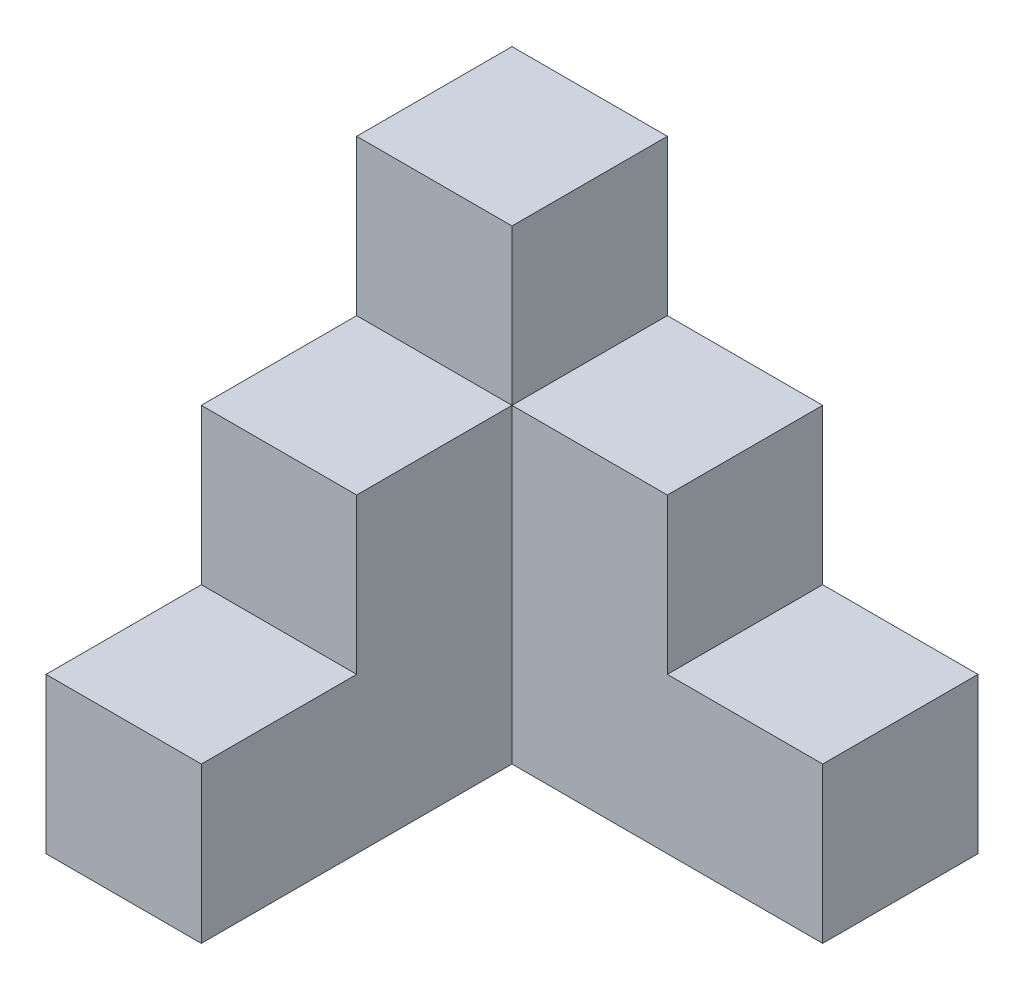
ISO-10303-21;
HEADER;
FILE_DESCRIPTION(('STEP AP214'),'2;1');
FILE_NAME('part.step','',(''),(''),'','','');
FILE_SCHEMA(('AUTOMOTIVE_DESIGN { 1 0 10303 214 1 1 1 1 }'));
ENDSEC;
DATA;
#1=APPLICATION_CONTEXT('core data for automotive mechanical design processes');
#2=APPLICATION_PROTOCOL_DEFINITION('international standard','automotive_design',2000,#1);
#3=PRODUCT_CONTEXT('',#1,'mechanical');
#4=PRODUCT('Part','Part','',(#3));
#5=PRODUCT_RELATED_PRODUCT_CATEGORY('part','',(#4));
#6=PRODUCT_DEFINITION_FORMATION('','',#4);
#7=PRODUCT_DEFINITION_CONTEXT('part definition',#1,'design');
#8=PRODUCT_DEFINITION('design','',#6,#7);
#9=PRODUCT_DEFINITION_SHAPE('','',#8);
#10=(LENGTH_UNIT() NAMED_UNIT(*) SI_UNIT(.MILLI.,.METRE.));
#11=(NAMED_UNIT(*) PLANE_ANGLE_UNIT() SI_UNIT($,.RADIAN.));
#12=(NAMED_UNIT(*) SI_UNIT($,.STERADIAN.) SOLID_ANGLE_UNIT());
#13=UNCERTAINTY_MEASURE_WITH_UNIT(LENGTH_MEASURE(1.E-05),#10,'distance_accuracy_value','');
#14=(GEOMETRIC_REPRESENTATION_CONTEXT(3) GLOBAL_UNCERTAINTY_ASSIGNED_CONTEXT((#13)) GLOBAL_UNIT_ASSIGNED_CONTEXT((#10,
#11,#12)) REPRESENTATION_CONTEXT('',''));
#15=CARTESIAN_POINT('',(0.,0.,0.));
#16=DIRECTION('',(0.,0.,1.));
#17=DIRECTION('',(1.,0.,0.));
#18=AXIS2_PLACEMENT_3D('',#15,#16,#17);
#19=CARTESIAN_POINT('',(0.,20.,0.));
#20=DIRECTION('',(0.,1.,0.));
#21=DIRECTION('',(0.,0.,1.));
#22=AXIS2_PLACEMENT_3D('',#19,#20,#21);
#23=PLANE('',#22);
#24=DIRECTION('',(0.,0.,-1.));
#25=VECTOR('',#24,1.);
#26=CARTESIAN_POINT('',(-222.247867371091,20.,236.439558245922));
#27=LINE('',#26,#25);
#28=CARTESIAN_POINT('',(-222.247867371091,20.,246.439558245922));
#29=VERTEX_POINT('',#28);
#30=CARTESIAN_POINT('',(-222.247867371091,20.,236.439558245922));
#31=VERTEX_POINT('',#30);
#32=EDGE_CURVE('E161',#29,#31,#27,.T.);
#33=ORIENTED_EDGE('',*,*,#32,.F.);
#34=DIRECTION('',(1.,0.,0.));
#35=VECTOR('',#34,1.);
#36=CARTESIAN_POINT('',(-212.247867371091,20.,246.439558245922));
#37=LINE('',#36,#35);
#38=CARTESIAN_POINT('',(-212.247867371091,20.,246.439558245922));
#39=VERTEX_POINT('',#38);
#40=EDGE_CURVE('E186',#29,#39,#37,.T.);
#41=ORIENTED_EDGE('',*,*,#40,.T.);
#42=DIRECTION('',(0.,0.,-1.));
#43=VECTOR('',#42,1.);
#44=CARTESIAN_POINT('',(-212.247867371091,20.,236.439558245922));
#45=LINE('',#44,#43);
#46=CARTESIAN_POINT('',(-212.247867371091,20.,236.439558245922));
#47=VERTEX_POINT('',#46);
#48=EDGE_CURVE('E189',#39,#47,#45,.T.);
#49=ORIENTED_EDGE('',*,*,#48,.T.);
#50=DIRECTION('',(-1.,0.,0.));
#51=VECTOR('',#50,1.);
#52=CARTESIAN_POINT('',(-222.247867371091,20.,236.439558245922));
#53=LINE('',#52,#51);
#54=EDGE_CURVE('E61',#47,#31,#53,.T.);
#55=ORIENTED_EDGE('',*,*,#54,.T.);
#56=EDGE_LOOP('',(#33,#41,#49,#55));
#57=FACE_BOUND('',#56,.T.);
#58=ADVANCED_FACE('F45',(#57),#23,.T.);
#59=CARTESIAN_POINT('',(0.,10.,0.));
#60=DIRECTION('',(0.,1.,0.));
#61=DIRECTION('',(0.,0.,1.));
#62=AXIS2_PLACEMENT_3D('',#59,#60,#61);
#63=PLANE('',#62);
#64=DIRECTION('',(0.,0.,-1.));
#65=VECTOR('',#64,1.);
#66=CARTESIAN_POINT('',(-212.247867371091,10.,236.439558245922));
#67=LINE('',#66,#65);
#68=CARTESIAN_POINT('',(-212.247867371091,10.,246.439558245922));
#69=VERTEX_POINT('',#68);
#70=CARTESIAN_POINT('',(-212.247867371091,10.,236.439558245922));
#71=VERTEX_POINT('',#70);
#72=EDGE_CURVE('E172',#69,#71,#67,.T.);
#73=ORIENTED_EDGE('',*,*,#72,.F.);
#74=DIRECTION('',(1.,0.,0.));
#75=VECTOR('',#74,1.);
#76=CARTESIAN_POINT('',(-202.247867371091,10.,246.439558245922));
#77=LINE('',#76,#75);
#78=CARTESIAN_POINT('',(-202.247867371091,10.,246.439558245922));
#79=VERTEX_POINT('',#78);
#80=EDGE_CURVE('E224',#69,#79,#77,.T.);
#81=ORIENTED_EDGE('',*,*,#80,.T.);
#82=DIRECTION('',(0.,0.,-1.));
#83=VECTOR('',#82,1.);
#84=CARTESIAN_POINT('',(-202.247867371091,10.,236.439558245922));
#85=LINE('',#84,#83);
#86=CARTESIAN_POINT('',(-202.247867371091,10.,236.439558245922));
#87=VERTEX_POINT('',#86);
#88=EDGE_CURVE('E227',#79,#87,#85,.T.);
#89=ORIENTED_EDGE('',*,*,#88,.T.);
#90=DIRECTION('',(-1.,0.,0.));
#91=VECTOR('',#90,1.);
#92=CARTESIAN_POINT('',(-222.247867371091,10.,236.439558245922));
#93=LINE('',#92,#91);
#94=EDGE_CURVE('E230',#87,#71,#93,.T.);
#95=ORIENTED_EDGE('',*,*,#94,.T.);
#96=EDGE_LOOP('',(#73,#81,#89,#95));
#97=FACE_BOUND('',#96,.T.);
#98=ADVANCED_FACE('F289',(#97),#63,.T.);
#99=CARTESIAN_POINT('',(-232.247867371091,10.,236.439558245922));
#100=DIRECTION('',(1.,0.,0.));
#101=DIRECTION('',(0.,0.,-1.));
#102=AXIS2_PLACEMENT_3D('',#99,#100,#101);
#103=PLANE('',#102);
#104=DIRECTION('',(0.,0.,1.));
#105=VECTOR('',#104,1.);
#106=CARTESIAN_POINT('',(-232.247867371091,0.,236.439558245922));
#107=LINE('',#106,#105);
#108=CARTESIAN_POINT('',(-232.247867371091,0.,236.439558245922));
#109=VERTEX_POINT('',#108);
#110=CARTESIAN_POINT('',(-232.247867371091,0.,266.439558245922));
#111=VERTEX_POINT('',#110);
#112=EDGE_CURVE('E213',#109,#111,#107,.T.);
#113=ORIENTED_EDGE('',*,*,#112,.T.);
#114=DIRECTION('',(0.,-1.,0.));
#115=VECTOR('',#114,1.);
#116=CARTESIAN_POINT('',(-232.247867371091,10.,266.439558245922));
#117=LINE('',#116,#115);
#118=CARTESIAN_POINT('',(-232.247867371091,10.,266.439558245922));
#119=VERTEX_POINT('',#118);
#120=EDGE_CURVE('E11',#119,#111,#117,.T.);
#121=ORIENTED_EDGE('',*,*,#120,.F.);
#122=DIRECTION('',(0.,0.,1.));
#123=VECTOR('',#122,1.);
#124=CARTESIAN_POINT('',(-232.247867371091,10.,236.439558245922));
#125=LINE('',#124,#123);
#126=CARTESIAN_POINT('',(-232.247867371091,10.,256.439558245922));
#127=VERTEX_POINT('',#126);
#128=EDGE_CURVE('E214',#127,#119,#125,.T.);
#129=ORIENTED_EDGE('',*,*,#128,.F.);
#130=DIRECTION('',(0.,-1.,0.));
#131=VECTOR('',#130,1.);
#132=CARTESIAN_POINT('',(-232.247867371091,20.,256.439558245922));
#133=LINE('',#132,#131);
#134=CARTESIAN_POINT('',(-232.247867371091,20.,256.439558245922));
#135=VERTEX_POINT('',#134);
#136=EDGE_CURVE('E209',#135,#127,#133,.T.);
#137=ORIENTED_EDGE('',*,*,#136,.F.);
#138=DIRECTION('',(0.,0.,1.));
#139=VECTOR('',#138,1.);
#140=CARTESIAN_POINT('',(-232.247867371091,20.,236.439558245922));
#141=LINE('',#140,#139);
#142=CARTESIAN_POINT('',(-232.247867371091,20.,246.439558245922));
#143=VERTEX_POINT('',#142);
#144=EDGE_CURVE('E165',#143,#135,#141,.T.);
#145=ORIENTED_EDGE('',*,*,#144,.F.);
#146=DIRECTION('',(0.,-1.,0.));
#147=VECTOR('',#146,1.);
#148=CARTESIAN_POINT('',(-232.247867371091,30.,246.439558245922));
#149=LINE('',#148,#147);
#150=CARTESIAN_POINT('',(-232.247867371091,30.,246.439558245922));
#151=VERTEX_POINT('',#150);
#152=EDGE_CURVE('E144',#151,#143,#149,.T.);
#153=ORIENTED_EDGE('',*,*,#152,.F.);
#154=DIRECTION('',(0.,0.,1.));
#155=VECTOR('',#154,1.);
#156=CARTESIAN_POINT('',(-232.247867371091,30.,236.439558245922));
#157=LINE('',#156,#155);
#158=CARTESIAN_POINT('',(-232.247867371091,30.,236.439558245922));
#159=VERTEX_POINT('',#158);
#160=EDGE_CURVE('E151',#159,#151,#157,.T.);
#161=ORIENTED_EDGE('',*,*,#160,.F.);
#162=DIRECTION('',(0.,-1.,0.));
#163=VECTOR('',#162,1.);
#164=CARTESIAN_POINT('',(-232.247867371091,10.,236.439558245922));
#165=LINE('',#164,#163);
#166=EDGE_CURVE('E233',#159,#109,#165,.T.);
#167=ORIENTED_EDGE('',*,*,#166,.T.);
#168=EDGE_LOOP('',(#113,#121,#129,#137,#145,#153,#161,#167));
#169=FACE_BOUND('',#168,.T.);
#170=ADVANCED_FACE('F47',(#169),#103,.F.);
#171=CARTESIAN_POINT('',(-232.247867371091,10.,266.439558245922));
#172=DIRECTION('',(0.,0.,-1.));
#173=DIRECTION('',(-1.,0.,0.));
#174=AXIS2_PLACEMENT_3D('',#171,#172,#173);
#175=PLANE('',#174);
#176=DIRECTION('',(1.,0.,0.));
#177=VECTOR('',#176,1.);
#178=CARTESIAN_POINT('',(-232.247867371091,0.,266.439558245922));
#179=LINE('',#178,#177);
#180=CARTESIAN_POINT('',(-222.247867371091,0.,266.439558245922));
#181=VERTEX_POINT('',#180);
#182=EDGE_CURVE('E236',#111,#181,#179,.T.);
#183=ORIENTED_EDGE('',*,*,#182,.T.);
#184=DIRECTION('',(0.,-1.,0.));
#185=VECTOR('',#184,1.);
#186=CARTESIAN_POINT('',(-222.247867371091,10.,266.439558245922));
#187=LINE('',#186,#185);
#188=CARTESIAN_POINT('',(-222.247867371091,10.,266.439558245922));
#189=VERTEX_POINT('',#188);
#190=EDGE_CURVE('E54',#189,#181,#187,.T.);
#191=ORIENTED_EDGE('',*,*,#190,.F.);
#192=DIRECTION('',(1.,0.,0.));
#193=VECTOR('',#192,1.);
#194=CARTESIAN_POINT('',(-232.247867371091,10.,266.439558245922));
#195=LINE('',#194,#193);
#196=EDGE_CURVE('E217',#119,#189,#195,.T.);
#197=ORIENTED_EDGE('',*,*,#196,.F.);
#198=ORIENTED_EDGE('',*,*,#120,.T.);
#199=EDGE_LOOP('',(#183,#191,#197,#198));
#200=FACE_BOUND('',#199,.T.);
#201=ADVANCED_FACE('F305',(#200),#175,.F.);
#202=CARTESIAN_POINT('',(-222.247867371091,10.,246.439558245922));
#203=DIRECTION('',(-1.,0.,0.));
#204=DIRECTION('',(0.,0.,1.));
#205=AXIS2_PLACEMENT_3D('',#202,#203,#204);
#206=PLANE('',#205);
#207=DIRECTION('',(0.,0.,-1.));
#208=VECTOR('',#207,1.);
#209=CARTESIAN_POINT('',(-222.247867371091,0.,246.439558245922));
#210=LINE('',#209,#208);
#211=CARTESIAN_POINT('',(-222.247867371091,0.,246.439558245922));
#212=VERTEX_POINT('',#211);
#213=EDGE_CURVE('E239',#181,#212,#210,.T.);
#214=ORIENTED_EDGE('',*,*,#213,.T.);
#215=DIRECTION('',(0.,-1.,0.));
#216=VECTOR('',#215,1.);
#217=CARTESIAN_POINT('',(-222.247867371091,10.,246.439558245922));
#218=LINE('',#217,#216);
#219=EDGE_CURVE('E261',#29,#212,#218,.T.);
#220=ORIENTED_EDGE('',*,*,#219,.F.);
#221=DIRECTION('',(0.,0.,-1.));
#222=VECTOR('',#221,1.);
#223=CARTESIAN_POINT('',(-222.247867371091,20.,246.439558245922));
#224=LINE('',#223,#222);
#225=CARTESIAN_POINT('',(-222.247867371091,20.,256.439558245922));
#226=VERTEX_POINT('',#225);
#227=EDGE_CURVE('E183',#226,#29,#224,.T.);
#228=ORIENTED_EDGE('',*,*,#227,.F.);
#229=DIRECTION('',(0.,-1.,0.));
#230=VECTOR('',#229,1.);
#231=CARTESIAN_POINT('',(-222.247867371091,20.,256.439558245922));
#232=LINE('',#231,#230);
#233=CARTESIAN_POINT('',(-222.247867371091,10.,256.439558245922));
#234=VERTEX_POINT('',#233);
#235=EDGE_CURVE('E205',#226,#234,#232,.T.);
#236=ORIENTED_EDGE('',*,*,#235,.T.);
#237=DIRECTION('',(0.,0.,-1.));
#238=VECTOR('',#237,1.);
#239=CARTESIAN_POINT('',(-222.247867371091,10.,246.439558245922));
#240=LINE('',#239,#238);
#241=EDGE_CURVE('E221',#189,#234,#240,.T.);
#242=ORIENTED_EDGE('',*,*,#241,.F.);
#243=ORIENTED_EDGE('',*,*,#190,.T.);
#244=EDGE_LOOP('',(#214,#220,#228,#236,#242,#243));
#245=FACE_BOUND('',#244,.T.);
#246=ADVANCED_FACE('F270',(#245),#206,.F.);
#247=CARTESIAN_POINT('',(-202.247867371091,10.,246.439558245922));
#248=DIRECTION('',(0.,0.,-1.));
#249=DIRECTION('',(-1.,0.,0.));
#250=AXIS2_PLACEMENT_3D('',#247,#248,#249);
#251=PLANE('',#250);
#252=DIRECTION('',(1.,0.,0.));
#253=VECTOR('',#252,1.);
#254=CARTESIAN_POINT('',(-202.247867371091,0.,246.439558245922));
#255=LINE('',#254,#253);
#256=CARTESIAN_POINT('',(-202.247867371091,0.,246.439558245922));
#257=VERTEX_POINT('',#256);
#258=EDGE_CURVE('E242',#212,#257,#255,.T.);
#259=ORIENTED_EDGE('',*,*,#258,.T.);
#260=DIRECTION('',(0.,-1.,0.));
#261=VECTOR('',#260,1.);
#262=CARTESIAN_POINT('',(-202.247867371091,10.,246.439558245922));
#263=LINE('',#262,#261);
#264=EDGE_CURVE('E257',#79,#257,#263,.T.);
#265=ORIENTED_EDGE('',*,*,#264,.F.);
#266=ORIENTED_EDGE('',*,*,#80,.F.);
#267=DIRECTION('',(0.,-1.,0.));
#268=VECTOR('',#267,1.);
#269=CARTESIAN_POINT('',(-212.247867371091,20.,246.439558245922));
#270=LINE('',#269,#268);
#271=EDGE_CURVE('E201',#39,#69,#270,.T.);
#272=ORIENTED_EDGE('',*,*,#271,.F.);
#273=ORIENTED_EDGE('',*,*,#40,.F.);
#274=ORIENTED_EDGE('',*,*,#219,.T.);
#275=EDGE_LOOP('',(#259,#265,#266,#272,#273,#274));
#276=FACE_BOUND('',#275,.T.);
#277=ADVANCED_FACE('F281',(#276),#251,.F.);
#278=CARTESIAN_POINT('',(-202.247867371091,10.,236.439558245922));
#279=DIRECTION('',(-1.,0.,0.));
#280=DIRECTION('',(0.,0.,1.));
#281=AXIS2_PLACEMENT_3D('',#278,#279,#280);
#282=PLANE('',#281);
#283=DIRECTION('',(0.,0.,-1.));
#284=VECTOR('',#283,1.);
#285=CARTESIAN_POINT('',(-202.247867371091,0.,236.439558245922));
#286=LINE('',#285,#284);
#287=CARTESIAN_POINT('',(-202.247867371091,0.,236.439558245922));
#288=VERTEX_POINT('',#287);
#289=EDGE_CURVE('E245',#257,#288,#286,.T.);
#290=ORIENTED_EDGE('',*,*,#289,.T.);
#291=DIRECTION('',(0.,-1.,0.));
#292=VECTOR('',#291,1.);
#293=CARTESIAN_POINT('',(-202.247867371091,10.,236.439558245922));
#294=LINE('',#293,#292);
#295=EDGE_CURVE('E253',#87,#288,#294,.T.);
#296=ORIENTED_EDGE('',*,*,#295,.F.);
#297=ORIENTED_EDGE('',*,*,#88,.F.);
#298=ORIENTED_EDGE('',*,*,#264,.T.);
#299=EDGE_LOOP('',(#290,#296,#297,#298));
#300=FACE_BOUND('',#299,.T.);
#301=ADVANCED_FACE('F285',(#300),#282,.F.);
#302=CARTESIAN_POINT('',(-232.247867371091,10.,236.439558245922));
#303=DIRECTION('',(0.,0.,1.));
#304=DIRECTION('',(1.,0.,0.));
#305=AXIS2_PLACEMENT_3D('',#302,#303,#304);
#306=PLANE('',#305);
#307=DIRECTION('',(-1.,0.,0.));
#308=VECTOR('',#307,1.);
#309=CARTESIAN_POINT('',(-232.247867371091,0.,236.439558245922));
#310=LINE('',#309,#308);
#311=EDGE_CURVE('E218',#288,#109,#310,.T.);
#312=ORIENTED_EDGE('',*,*,#311,.T.);
#313=ORIENTED_EDGE('',*,*,#166,.F.);
#314=DIRECTION('',(-1.,0.,0.));
#315=VECTOR('',#314,1.);
#316=CARTESIAN_POINT('',(-232.247867371091,30.,236.439558245922));
#317=LINE('',#316,#315);
#318=CARTESIAN_POINT('',(-222.247867371091,30.,236.439558245922));
#319=VERTEX_POINT('',#318);
#320=EDGE_CURVE('E157',#319,#159,#317,.T.);
#321=ORIENTED_EDGE('',*,*,#320,.F.);
#322=DIRECTION('',(0.,-1.,0.));
#323=VECTOR('',#322,1.);
#324=CARTESIAN_POINT('',(-222.247867371091,30.,236.439558245922));
#325=LINE('',#324,#323);
#326=EDGE_CURVE('E174',#319,#31,#325,.T.);
#327=ORIENTED_EDGE('',*,*,#326,.T.);
#328=ORIENTED_EDGE('',*,*,#54,.F.);
#329=DIRECTION('',(0.,-1.,0.));
#330=VECTOR('',#329,1.);
#331=CARTESIAN_POINT('',(-212.247867371091,20.,236.439558245922));
#332=LINE('',#331,#330);
#333=EDGE_CURVE('E193',#47,#71,#332,.T.);
#334=ORIENTED_EDGE('',*,*,#333,.T.);
#335=ORIENTED_EDGE('',*,*,#94,.F.);
#336=ORIENTED_EDGE('',*,*,#295,.T.);
#337=EDGE_LOOP('',(#312,#313,#321,#327,#328,#334,#335,#336));
#338=FACE_BOUND('',#337,.T.);
#339=ADVANCED_FACE('F332',(#338),#306,.F.);
#340=DIRECTION('',(1.,0.,0.));
#341=VECTOR('',#340,1.);
#342=CARTESIAN_POINT('',(-232.247867371091,10.,256.439558245922));
#343=LINE('',#342,#341);
#344=EDGE_CURVE('E167',#127,#234,#343,.T.);
#345=ORIENTED_EDGE('',*,*,#344,.F.);
#346=ORIENTED_EDGE('',*,*,#128,.T.);
#347=ORIENTED_EDGE('',*,*,#196,.T.);
#348=ORIENTED_EDGE('',*,*,#241,.T.);
#349=EDGE_LOOP('',(#345,#346,#347,#348));
#350=FACE_BOUND('',#349,.T.);
#351=ADVANCED_FACE('F303',(#350),#63,.T.);
#352=CARTESIAN_POINT('',(0.,0.,0.));
#353=DIRECTION('',(0.,1.,0.));
#354=DIRECTION('',(0.,0.,1.));
#355=AXIS2_PLACEMENT_3D('',#352,#353,#354);
#356=PLANE('',#355);
#357=ORIENTED_EDGE('',*,*,#112,.F.);
#358=ORIENTED_EDGE('',*,*,#311,.F.);
#359=ORIENTED_EDGE('',*,*,#289,.F.);
#360=ORIENTED_EDGE('',*,*,#258,.F.);
#361=ORIENTED_EDGE('',*,*,#213,.F.);
#362=ORIENTED_EDGE('',*,*,#182,.F.);
#363=EDGE_LOOP('',(#357,#358,#359,#360,#361,#362));
#364=FACE_BOUND('',#363,.T.);
#365=ADVANCED_FACE('F277',(#364),#356,.F.);
#366=CARTESIAN_POINT('',(-232.247867371091,20.,256.439558245922));
#367=DIRECTION('',(0.,0.,-1.));
#368=DIRECTION('',(-1.,0.,0.));
#369=AXIS2_PLACEMENT_3D('',#366,#367,#368);
#370=PLANE('',#369);
#371=ORIENTED_EDGE('',*,*,#344,.T.);
#372=ORIENTED_EDGE('',*,*,#235,.F.);
#373=DIRECTION('',(1.,0.,0.));
#374=VECTOR('',#373,1.);
#375=CARTESIAN_POINT('',(-232.247867371091,20.,256.439558245922));
#376=LINE('',#375,#374);
#377=EDGE_CURVE('E180',#135,#226,#376,.T.);
#378=ORIENTED_EDGE('',*,*,#377,.F.);
#379=ORIENTED_EDGE('',*,*,#136,.T.);
#380=EDGE_LOOP('',(#371,#372,#378,#379));
#381=FACE_BOUND('',#380,.T.);
#382=ADVANCED_FACE('F300',(#381),#370,.F.);
#383=CARTESIAN_POINT('',(-212.247867371091,20.,236.439558245922));
#384=DIRECTION('',(-1.,0.,0.));
#385=DIRECTION('',(0.,0.,1.));
#386=AXIS2_PLACEMENT_3D('',#383,#384,#385);
#387=PLANE('',#386);
#388=ORIENTED_EDGE('',*,*,#72,.T.);
#389=ORIENTED_EDGE('',*,*,#333,.F.);
#390=ORIENTED_EDGE('',*,*,#48,.F.);
#391=ORIENTED_EDGE('',*,*,#271,.T.);
#392=EDGE_LOOP('',(#388,#389,#390,#391));
#393=FACE_BOUND('',#392,.T.);
#394=ADVANCED_FACE('F293',(#393),#387,.F.);
#395=DIRECTION('',(1.,0.,0.));
#396=VECTOR('',#395,1.);
#397=CARTESIAN_POINT('',(-232.247867371091,20.,246.439558245922));
#398=LINE('',#397,#396);
#399=EDGE_CURVE('E69',#143,#29,#398,.T.);
#400=ORIENTED_EDGE('',*,*,#399,.F.);
#401=ORIENTED_EDGE('',*,*,#144,.T.);
#402=ORIENTED_EDGE('',*,*,#377,.T.);
#403=ORIENTED_EDGE('',*,*,#227,.T.);
#404=EDGE_LOOP('',(#400,#401,#402,#403));
#405=FACE_BOUND('',#404,.T.);
#406=ADVANCED_FACE('F296',(#405),#23,.T.);
#407=CARTESIAN_POINT('',(-232.247867371091,30.,246.439558245922));
#408=DIRECTION('',(0.,0.,-1.));
#409=DIRECTION('',(-1.,0.,0.));
#410=AXIS2_PLACEMENT_3D('',#407,#408,#409);
#411=PLANE('',#410);
#412=ORIENTED_EDGE('',*,*,#399,.T.);
#413=DIRECTION('',(0.,-1.,0.));
#414=VECTOR('',#413,1.);
#415=CARTESIAN_POINT('',(-222.247867371091,30.,246.439558245922));
#416=LINE('',#415,#414);
#417=CARTESIAN_POINT('',(-222.247867371091,30.,246.439558245922));
#418=VERTEX_POINT('',#417);
#419=EDGE_CURVE('E146',#418,#29,#416,.T.);
#420=ORIENTED_EDGE('',*,*,#419,.F.);
#421=DIRECTION('',(1.,0.,0.));
#422=VECTOR('',#421,1.);
#423=CARTESIAN_POINT('',(-232.247867371091,30.,246.439558245922));
#424=LINE('',#423,#422);
#425=EDGE_CURVE('E140',#151,#418,#424,.T.);
#426=ORIENTED_EDGE('',*,*,#425,.F.);
#427=ORIENTED_EDGE('',*,*,#152,.T.);
#428=EDGE_LOOP('',(#412,#420,#426,#427));
#429=FACE_BOUND('',#428,.T.);
#430=ADVANCED_FACE('F142',(#429),#411,.F.);
#431=CARTESIAN_POINT('',(-222.247867371091,30.,236.439558245922));
#432=DIRECTION('',(-1.,0.,0.));
#433=DIRECTION('',(0.,0.,1.));
#434=AXIS2_PLACEMENT_3D('',#431,#432,#433);
#435=PLANE('',#434);
#436=ORIENTED_EDGE('',*,*,#32,.T.);
#437=ORIENTED_EDGE('',*,*,#326,.F.);
#438=DIRECTION('',(0.,0.,-1.));
#439=VECTOR('',#438,1.);
#440=CARTESIAN_POINT('',(-222.247867371091,30.,236.439558245922));
#441=LINE('',#440,#439);
#442=EDGE_CURVE('E150',#418,#319,#441,.T.);
#443=ORIENTED_EDGE('',*,*,#442,.F.);
#444=ORIENTED_EDGE('',*,*,#419,.T.);
#445=EDGE_LOOP('',(#436,#437,#443,#444));
#446=FACE_BOUND('',#445,.T.);
#447=ADVANCED_FACE('F325',(#446),#435,.F.);
#448=CARTESIAN_POINT('',(0.,30.,0.));
#449=DIRECTION('',(0.,1.,0.));
#450=DIRECTION('',(0.,0.,1.));
#451=AXIS2_PLACEMENT_3D('',#448,#449,#450);
#452=PLANE('',#451);
#453=ORIENTED_EDGE('',*,*,#160,.T.);
#454=ORIENTED_EDGE('',*,*,#425,.T.);
#455=ORIENTED_EDGE('',*,*,#442,.T.);
#456=ORIENTED_EDGE('',*,*,#320,.T.);
#457=EDGE_LOOP('',(#453,#454,#455,#456));
#458=FACE_BOUND('',#457,.T.);
#459=ADVANCED_FACE('F155',(#458),#452,.T.);
#460=CLOSED_SHELL('',(#58,#98,#170,#201,#246,#277,#301,#339,#351,#365,#382,#394,#406,#430,#447,#459));
#461=MANIFOLD_SOLID_BREP('B2',#460);
#462=ADVANCED_BREP_SHAPE_REPRESENTATION('',(#18,#461),#14);
#463=SHAPE_DEFINITION_REPRESENTATION(#9,#462);
ENDSEC;
END-ISO-10303-21;
